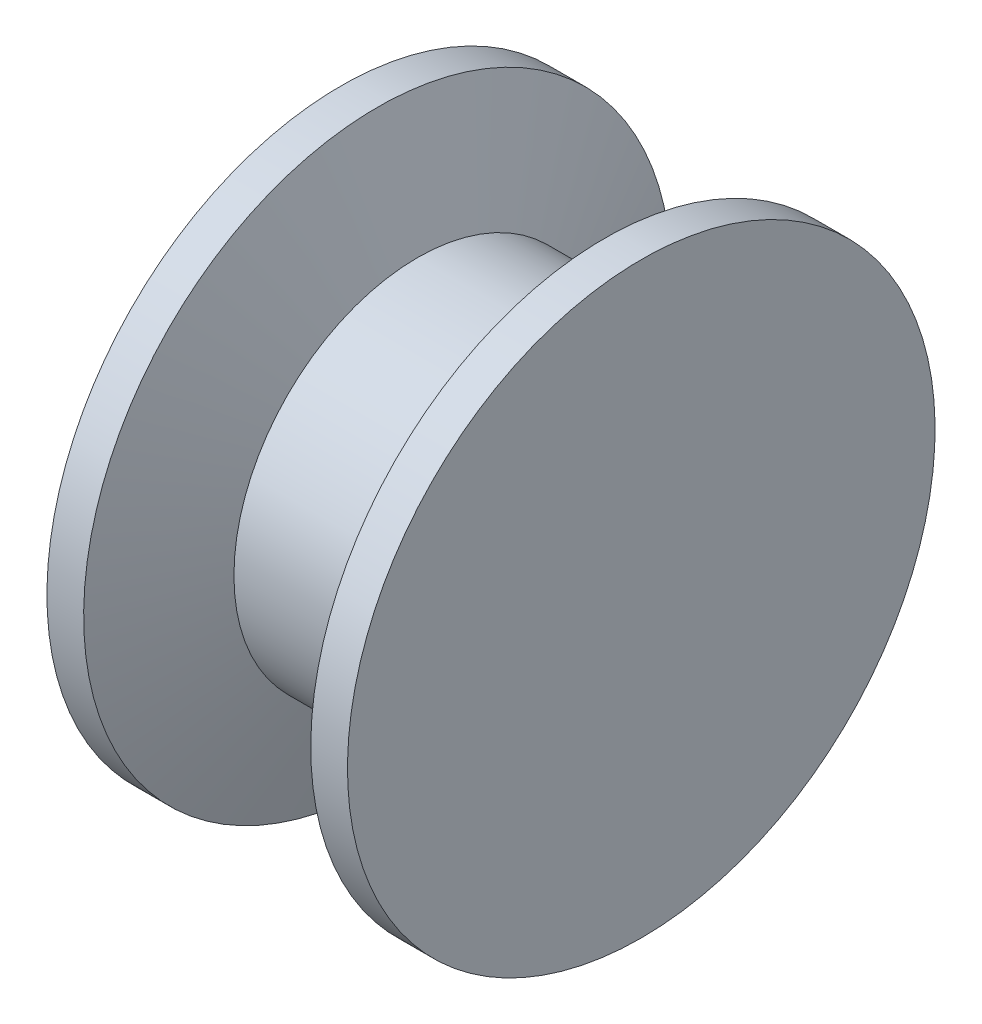
ISO-10303-21;
HEADER;
FILE_DESCRIPTION(('STEP AP214'),'2;1');
FILE_NAME('part.step','',(''),(''),'','','');
FILE_SCHEMA(('AUTOMOTIVE_DESIGN { 1 0 10303 214 1 1 1 1 }'));
ENDSEC;
DATA;
#1=APPLICATION_CONTEXT('core data for automotive mechanical design processes');
#2=APPLICATION_PROTOCOL_DEFINITION('international standard','automotive_design',2000,#1);
#3=PRODUCT_CONTEXT('',#1,'mechanical');
#4=PRODUCT('Part','Part','',(#3));
#5=PRODUCT_RELATED_PRODUCT_CATEGORY('part','',(#4));
#6=PRODUCT_DEFINITION_FORMATION('','',#4);
#7=PRODUCT_DEFINITION_CONTEXT('part definition',#1,'design');
#8=PRODUCT_DEFINITION('design','',#6,#7);
#9=PRODUCT_DEFINITION_SHAPE('','',#8);
#10=(LENGTH_UNIT() NAMED_UNIT(*) SI_UNIT(.MILLI.,.METRE.));
#11=(NAMED_UNIT(*) PLANE_ANGLE_UNIT() SI_UNIT($,.RADIAN.));
#12=(NAMED_UNIT(*) SI_UNIT($,.STERADIAN.) SOLID_ANGLE_UNIT());
#13=UNCERTAINTY_MEASURE_WITH_UNIT(LENGTH_MEASURE(1.E-05),#10,'distance_accuracy_value','');
#14=(GEOMETRIC_REPRESENTATION_CONTEXT(3) GLOBAL_UNCERTAINTY_ASSIGNED_CONTEXT((#13)) GLOBAL_UNIT_ASSIGNED_CONTEXT((#10,
#11,#12)) REPRESENTATION_CONTEXT('',''));
#15=CARTESIAN_POINT('',(0.,0.,0.));
#16=DIRECTION('',(0.,0.,1.));
#17=DIRECTION('',(1.,0.,0.));
#18=AXIS2_PLACEMENT_3D('',#15,#16,#17);
#19=CARTESIAN_POINT('',(-20.4595535139929,29.7903227131328,0.));
#20=DIRECTION('',(1.,0.,0.));
#21=DIRECTION('',(0.,1.,0.));
#22=AXIS2_PLACEMENT_3D('',#19,#20,#21);
#23=PLANE('',#22);
#24=CARTESIAN_POINT('',(-20.4595535139929,-10.2096772868672,0.));
#25=DIRECTION('',(-1.,0.,0.));
#26=DIRECTION('',(0.,-1.,0.));
#27=AXIS2_PLACEMENT_3D('',#24,#25,#26);
#28=CIRCLE('',#27,40.);
#29=CARTESIAN_POINT('',(-20.4595535139929,-50.2096772868672,0.));
#30=VERTEX_POINT('',#29);
#31=EDGE_CURVE('E57',#30,#30,#28,.T.);
#32=ORIENTED_EDGE('',*,*,#31,.T.);
#33=EDGE_LOOP('',(#32));
#34=FACE_BOUND('',#33,.T.);
#35=ADVANCED_FACE('F35',(#34),#23,.F.);
#36=CARTESIAN_POINT('',(20.4595535139929,29.7903227131328,0.));
#37=DIRECTION('',(-1.,0.,0.));
#38=DIRECTION('',(0.,-1.,0.));
#39=AXIS2_PLACEMENT_3D('',#36,#37,#38);
#40=PLANE('',#39);
#41=CARTESIAN_POINT('',(20.4595535139929,-10.2096772868672,0.));
#42=DIRECTION('',(-1.,0.,0.));
#43=DIRECTION('',(0.,-1.,0.));
#44=AXIS2_PLACEMENT_3D('',#41,#42,#43);
#45=CIRCLE('',#44,40.);
#46=CARTESIAN_POINT('',(20.459553513993,-50.2096772868672,0.));
#47=VERTEX_POINT('',#46);
#48=EDGE_CURVE('E10',#47,#47,#45,.T.);
#49=ORIENTED_EDGE('',*,*,#48,.F.);
#50=EDGE_LOOP('',(#49));
#51=FACE_BOUND('',#50,.T.);
#52=ADVANCED_FACE('F87',(#51),#40,.F.);
#53=CARTESIAN_POINT('',(-20.4595535139929,-10.2096772868672,0.));
#54=DIRECTION('',(-1.,0.,0.));
#55=DIRECTION('',(0.,-1.,0.));
#56=AXIS2_PLACEMENT_3D('',#53,#54,#55);
#57=CYLINDRICAL_SURFACE('',#56,40.);
#58=CARTESIAN_POINT('',(15.4595535139929,-10.2096772868672,0.));
#59=DIRECTION('',(-1.,0.,0.));
#60=DIRECTION('',(0.,-1.,0.));
#61=AXIS2_PLACEMENT_3D('',#58,#59,#60);
#62=CIRCLE('',#61,40.);
#63=CARTESIAN_POINT('',(15.4595535139929,-50.2096772868672,0.));
#64=VERTEX_POINT('',#63);
#65=EDGE_CURVE('E41',#64,#64,#62,.T.);
#66=ORIENTED_EDGE('',*,*,#65,.F.);
#67=EDGE_LOOP('',(#66));
#68=FACE_BOUND('',#67,.T.);
#69=ORIENTED_EDGE('',*,*,#48,.T.);
#70=EDGE_LOOP('',(#69));
#71=FACE_BOUND('',#70,.T.);
#72=ADVANCED_FACE('F82',(#68,#71),#57,.T.);
#73=CARTESIAN_POINT('',(15.4595535139929,-10.2096772868672,0.));
#74=DIRECTION('',(1.,0.,0.));
#75=DIRECTION('',(0.,1.,0.));
#76=AXIS2_PLACEMENT_3D('',#73,#74,#75);
#77=CONICAL_SURFACE('',#76,40.,1.22173047639604);
#78=CARTESIAN_POINT('',(10.,-10.2096772868672,0.));
#79=DIRECTION('',(-1.,0.,0.));
#80=DIRECTION('',(0.,-1.,0.));
#81=AXIS2_PLACEMENT_3D('',#78,#79,#80);
#82=CIRCLE('',#81,25.);
#83=CARTESIAN_POINT('',(10.,-35.2096772868672,0.));
#84=VERTEX_POINT('',#83);
#85=EDGE_CURVE('E45',#84,#84,#82,.T.);
#86=ORIENTED_EDGE('',*,*,#85,.F.);
#87=EDGE_LOOP('',(#86));
#88=FACE_BOUND('',#87,.T.);
#89=ORIENTED_EDGE('',*,*,#65,.T.);
#90=EDGE_LOOP('',(#89));
#91=FACE_BOUND('',#90,.T.);
#92=ADVANCED_FACE('F77',(#88,#91),#77,.T.);
#93=CARTESIAN_POINT('',(-20.4595535139929,-10.2096772868672,0.));
#94=DIRECTION('',(-1.,0.,0.));
#95=DIRECTION('',(0.,-1.,0.));
#96=AXIS2_PLACEMENT_3D('',#93,#94,#95);
#97=CYLINDRICAL_SURFACE('',#96,25.);
#98=CARTESIAN_POINT('',(-10.,-10.2096772868672,0.));
#99=DIRECTION('',(-1.,0.,0.));
#100=DIRECTION('',(0.,-1.,0.));
#101=AXIS2_PLACEMENT_3D('',#98,#99,#100);
#102=CIRCLE('',#101,25.);
#103=CARTESIAN_POINT('',(-9.99999999999999,-35.2096772868672,0.));
#104=VERTEX_POINT('',#103);
#105=EDGE_CURVE('E49',#104,#104,#102,.T.);
#106=ORIENTED_EDGE('',*,*,#105,.F.);
#107=EDGE_LOOP('',(#106));
#108=FACE_BOUND('',#107,.T.);
#109=ORIENTED_EDGE('',*,*,#85,.T.);
#110=EDGE_LOOP('',(#109));
#111=FACE_BOUND('',#110,.T.);
#112=ADVANCED_FACE('F71',(#108,#111),#97,.T.);
#113=CARTESIAN_POINT('',(-10.,-10.2096772868672,0.));
#114=DIRECTION('',(-1.,0.,0.));
#115=DIRECTION('',(0.,-1.,0.));
#116=AXIS2_PLACEMENT_3D('',#113,#114,#115);
#117=CONICAL_SURFACE('',#116,25.,1.22173047639604);
#118=CARTESIAN_POINT('',(-15.4595535139929,-10.2096772868672,0.));
#119=DIRECTION('',(-1.,0.,0.));
#120=DIRECTION('',(0.,-1.,0.));
#121=AXIS2_PLACEMENT_3D('',#118,#119,#120);
#122=CIRCLE('',#121,40.);
#123=CARTESIAN_POINT('',(-15.4595535139929,-50.2096772868672,0.));
#124=VERTEX_POINT('',#123);
#125=EDGE_CURVE('E54',#124,#124,#122,.T.);
#126=ORIENTED_EDGE('',*,*,#125,.F.);
#127=EDGE_LOOP('',(#126));
#128=FACE_BOUND('',#127,.T.);
#129=ORIENTED_EDGE('',*,*,#105,.T.);
#130=EDGE_LOOP('',(#129));
#131=FACE_BOUND('',#130,.T.);
#132=ADVANCED_FACE('F65',(#128,#131),#117,.T.);
#133=CARTESIAN_POINT('',(-20.4595535139929,-10.2096772868672,0.));
#134=DIRECTION('',(-1.,0.,0.));
#135=DIRECTION('',(0.,-1.,0.));
#136=AXIS2_PLACEMENT_3D('',#133,#134,#135);
#137=CYLINDRICAL_SURFACE('',#136,40.);
#138=ORIENTED_EDGE('',*,*,#31,.F.);
#139=EDGE_LOOP('',(#138));
#140=FACE_BOUND('',#139,.T.);
#141=ORIENTED_EDGE('',*,*,#125,.T.);
#142=EDGE_LOOP('',(#141));
#143=FACE_BOUND('',#142,.T.);
#144=ADVANCED_FACE('F62',(#140,#143),#137,.T.);
#145=CLOSED_SHELL('',(#35,#52,#72,#92,#112,#132,#144));
#146=MANIFOLD_SOLID_BREP('B2',#145);
#147=ADVANCED_BREP_SHAPE_REPRESENTATION('',(#18,#146),#14);
#148=SHAPE_DEFINITION_REPRESENTATION(#9,#147);
ENDSEC;
END-ISO-10303-21;
